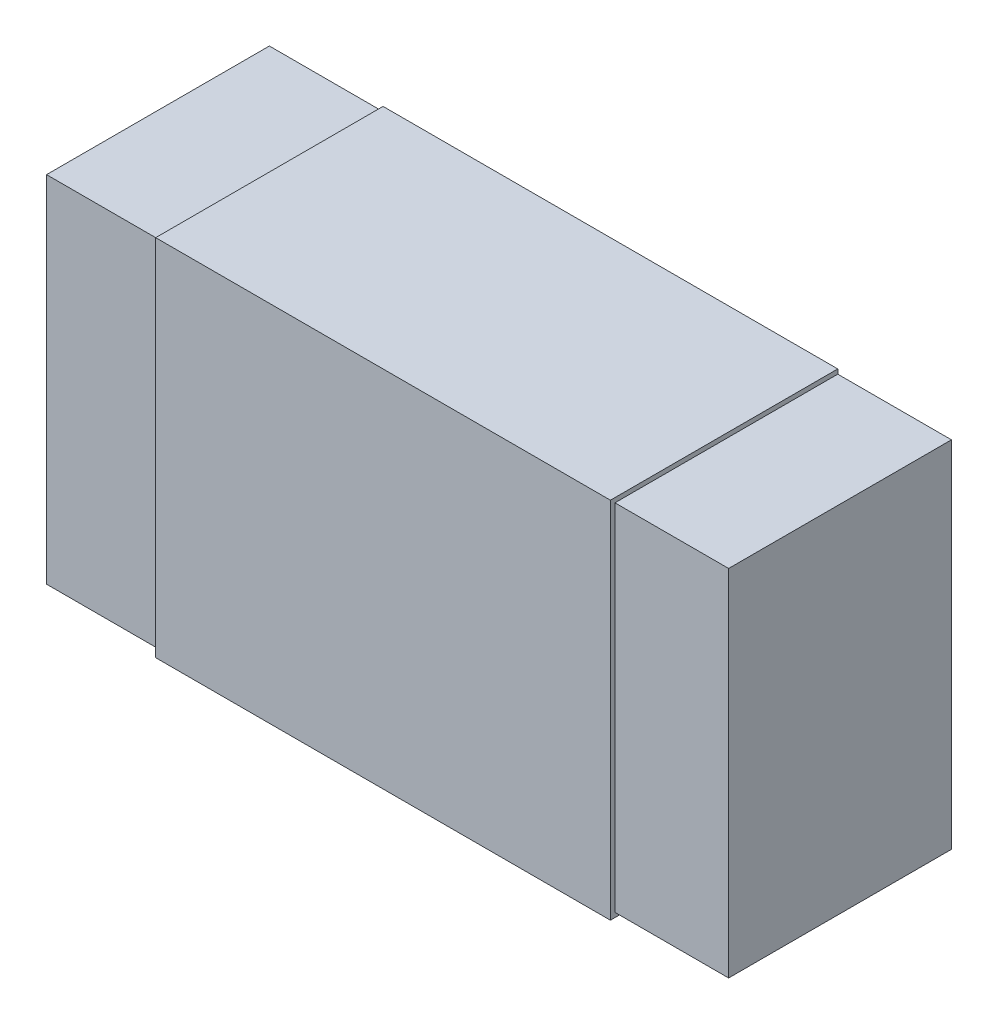
ISO-10303-21;
HEADER;
FILE_DESCRIPTION(('STEP AP214'),'2;1');
FILE_NAME('part.step','',(''),(''),'','','');
FILE_SCHEMA(('AUTOMOTIVE_DESIGN { 1 0 10303 214 1 1 1 1 }'));
ENDSEC;
DATA;
#1=APPLICATION_CONTEXT('core data for automotive mechanical design processes');
#2=APPLICATION_PROTOCOL_DEFINITION('international standard','automotive_design',2000,#1);
#3=PRODUCT_CONTEXT('',#1,'mechanical');
#4=PRODUCT('Part','Part','',(#3));
#5=PRODUCT_RELATED_PRODUCT_CATEGORY('part','',(#4));
#6=PRODUCT_DEFINITION_FORMATION('','',#4);
#7=PRODUCT_DEFINITION_CONTEXT('part definition',#1,'design');
#8=PRODUCT_DEFINITION('design','',#6,#7);
#9=PRODUCT_DEFINITION_SHAPE('','',#8);
#10=(LENGTH_UNIT() NAMED_UNIT(*) SI_UNIT(.MILLI.,.METRE.));
#11=(NAMED_UNIT(*) PLANE_ANGLE_UNIT() SI_UNIT($,.RADIAN.));
#12=(NAMED_UNIT(*) SI_UNIT($,.STERADIAN.) SOLID_ANGLE_UNIT());
#13=UNCERTAINTY_MEASURE_WITH_UNIT(LENGTH_MEASURE(1.E-05),#10,'distance_accuracy_value','');
#14=(GEOMETRIC_REPRESENTATION_CONTEXT(3) GLOBAL_UNCERTAINTY_ASSIGNED_CONTEXT((#13)) GLOBAL_UNIT_ASSIGNED_CONTEXT((#10,
#11,#12)) REPRESENTATION_CONTEXT('',''));
#15=CARTESIAN_POINT('',(0.,0.,0.));
#16=DIRECTION('',(0.,0.,1.));
#17=DIRECTION('',(1.,0.,0.));
#18=AXIS2_PLACEMENT_3D('',#15,#16,#17);
#19=CARTESIAN_POINT('',(-0.5,0.4,0.5));
#20=DIRECTION('',(1.,0.,0.));
#21=DIRECTION('',(0.,1.,0.));
#22=AXIS2_PLACEMENT_3D('',#19,#20,#21);
#23=PLANE('',#22);
#24=DIRECTION('',(0.,0.,-1.));
#25=VECTOR('',#24,1.);
#26=CARTESIAN_POINT('',(-0.5,0.39,0.49));
#27=LINE('',#26,#25);
#28=CARTESIAN_POINT('',(-0.5,0.39,0.49));
#29=VERTEX_POINT('',#28);
#30=CARTESIAN_POINT('',(-0.5,0.39,0.));
#31=VERTEX_POINT('',#30);
#32=EDGE_CURVE('E150',#29,#31,#27,.T.);
#33=ORIENTED_EDGE('',*,*,#32,.F.);
#34=DIRECTION('',(0.,-1.,0.));
#35=VECTOR('',#34,1.);
#36=CARTESIAN_POINT('',(-0.5,0.39,0.49));
#37=LINE('',#36,#35);
#38=CARTESIAN_POINT('',(-0.5,-0.39,0.49));
#39=VERTEX_POINT('',#38);
#40=EDGE_CURVE('E142',#29,#39,#37,.T.);
#41=ORIENTED_EDGE('',*,*,#40,.T.);
#42=DIRECTION('',(0.,0.,-1.));
#43=VECTOR('',#42,1.);
#44=CARTESIAN_POINT('',(-0.5,-0.39,0.49));
#45=LINE('',#44,#43);
#46=CARTESIAN_POINT('',(-0.5,-0.39,0.));
#47=VERTEX_POINT('',#46);
#48=EDGE_CURVE('E127',#39,#47,#45,.T.);
#49=ORIENTED_EDGE('',*,*,#48,.T.);
#50=DIRECTION('',(0.,-1.,0.));
#51=VECTOR('',#50,1.);
#52=CARTESIAN_POINT('',(-0.5,0.4,0.));
#53=LINE('',#52,#51);
#54=CARTESIAN_POINT('',(-0.5,-0.4,0.));
#55=VERTEX_POINT('',#54);
#56=EDGE_CURVE('E236',#47,#55,#53,.T.);
#57=ORIENTED_EDGE('',*,*,#56,.T.);
#58=DIRECTION('',(0.,0.,-1.));
#59=VECTOR('',#58,1.);
#60=CARTESIAN_POINT('',(-0.5,-0.4,0.5));
#61=LINE('',#60,#59);
#62=CARTESIAN_POINT('',(-0.5,-0.4,0.5));
#63=VERTEX_POINT('',#62);
#64=EDGE_CURVE('E245',#63,#55,#61,.T.);
#65=ORIENTED_EDGE('',*,*,#64,.F.);
#66=DIRECTION('',(0.,-1.,0.));
#67=VECTOR('',#66,1.);
#68=CARTESIAN_POINT('',(-0.5,0.4,0.5));
#69=LINE('',#68,#67);
#70=CARTESIAN_POINT('',(-0.5,0.4,0.5));
#71=VERTEX_POINT('',#70);
#72=EDGE_CURVE('E222',#71,#63,#69,.T.);
#73=ORIENTED_EDGE('',*,*,#72,.F.);
#74=DIRECTION('',(0.,0.,-1.));
#75=VECTOR('',#74,1.);
#76=CARTESIAN_POINT('',(-0.5,0.4,0.5));
#77=LINE('',#76,#75);
#78=CARTESIAN_POINT('',(-0.5,0.4,0.));
#79=VERTEX_POINT('',#78);
#80=EDGE_CURVE('E48',#71,#79,#77,.T.);
#81=ORIENTED_EDGE('',*,*,#80,.T.);
#82=EDGE_CURVE('E237',#79,#31,#53,.T.);
#83=ORIENTED_EDGE('',*,*,#82,.T.);
#84=EDGE_LOOP('',(#33,#41,#49,#57,#65,#73,#81,#83));
#85=FACE_BOUND('',#84,.T.);
#86=ADVANCED_FACE('F39',(#85),#23,.F.);
#87=CARTESIAN_POINT('',(0.5,0.4,0.5));
#88=DIRECTION('',(-1.,0.,0.));
#89=DIRECTION('',(0.,-1.,0.));
#90=AXIS2_PLACEMENT_3D('',#87,#88,#89);
#91=PLANE('',#90);
#92=DIRECTION('',(0.,0.,-1.));
#93=VECTOR('',#92,1.);
#94=CARTESIAN_POINT('',(0.5,-0.39,0.49));
#95=LINE('',#94,#93);
#96=CARTESIAN_POINT('',(0.5,-0.39,0.49));
#97=VERTEX_POINT('',#96);
#98=CARTESIAN_POINT('',(0.5,-0.39,0.));
#99=VERTEX_POINT('',#98);
#100=EDGE_CURVE('E202',#97,#99,#95,.T.);
#101=ORIENTED_EDGE('',*,*,#100,.F.);
#102=DIRECTION('',(0.,1.,0.));
#103=VECTOR('',#102,1.);
#104=CARTESIAN_POINT('',(0.5,0.39,0.49));
#105=LINE('',#104,#103);
#106=CARTESIAN_POINT('',(0.5,0.39,0.49));
#107=VERTEX_POINT('',#106);
#108=EDGE_CURVE('E175',#97,#107,#105,.T.);
#109=ORIENTED_EDGE('',*,*,#108,.T.);
#110=DIRECTION('',(0.,0.,-1.));
#111=VECTOR('',#110,1.);
#112=CARTESIAN_POINT('',(0.5,0.39,0.49));
#113=LINE('',#112,#111);
#114=CARTESIAN_POINT('',(0.5,0.39,0.));
#115=VERTEX_POINT('',#114);
#116=EDGE_CURVE('E192',#107,#115,#113,.T.);
#117=ORIENTED_EDGE('',*,*,#116,.T.);
#118=DIRECTION('',(0.,1.,0.));
#119=VECTOR('',#118,1.);
#120=CARTESIAN_POINT('',(0.5,0.4,0.));
#121=LINE('',#120,#119);
#122=CARTESIAN_POINT('',(0.5,0.4,0.));
#123=VERTEX_POINT('',#122);
#124=EDGE_CURVE('E205',#115,#123,#121,.T.);
#125=ORIENTED_EDGE('',*,*,#124,.T.);
#126=DIRECTION('',(0.,0.,-1.));
#127=VECTOR('',#126,1.);
#128=CARTESIAN_POINT('',(0.5,0.4,0.5));
#129=LINE('',#128,#127);
#130=CARTESIAN_POINT('',(0.5,0.4,0.5));
#131=VERTEX_POINT('',#130);
#132=EDGE_CURVE('E11',#131,#123,#129,.T.);
#133=ORIENTED_EDGE('',*,*,#132,.F.);
#134=DIRECTION('',(0.,1.,0.));
#135=VECTOR('',#134,1.);
#136=CARTESIAN_POINT('',(0.5,0.4,0.5));
#137=LINE('',#136,#135);
#138=CARTESIAN_POINT('',(0.5,-0.4,0.5));
#139=VERTEX_POINT('',#138);
#140=EDGE_CURVE('E214',#139,#131,#137,.T.);
#141=ORIENTED_EDGE('',*,*,#140,.F.);
#142=DIRECTION('',(0.,0.,-1.));
#143=VECTOR('',#142,1.);
#144=CARTESIAN_POINT('',(0.5,-0.4,0.5));
#145=LINE('',#144,#143);
#146=CARTESIAN_POINT('',(0.5,-0.4,0.));
#147=VERTEX_POINT('',#146);
#148=EDGE_CURVE('E228',#139,#147,#145,.T.);
#149=ORIENTED_EDGE('',*,*,#148,.T.);
#150=EDGE_CURVE('E229',#147,#99,#121,.T.);
#151=ORIENTED_EDGE('',*,*,#150,.T.);
#152=EDGE_LOOP('',(#101,#109,#117,#125,#133,#141,#149,#151));
#153=FACE_BOUND('',#152,.T.);
#154=ADVANCED_FACE('F41',(#153),#91,.F.);
#155=CARTESIAN_POINT('',(-0.5,0.4,0.5));
#156=DIRECTION('',(0.,-1.,0.));
#157=DIRECTION('',(0.,0.,-1.));
#158=AXIS2_PLACEMENT_3D('',#155,#156,#157);
#159=PLANE('',#158);
#160=DIRECTION('',(-1.,0.,0.));
#161=VECTOR('',#160,1.);
#162=CARTESIAN_POINT('',(-0.5,0.4,0.));
#163=LINE('',#162,#161);
#164=EDGE_CURVE('E233',#123,#79,#163,.T.);
#165=ORIENTED_EDGE('',*,*,#164,.T.);
#166=ORIENTED_EDGE('',*,*,#80,.F.);
#167=DIRECTION('',(-1.,0.,0.));
#168=VECTOR('',#167,1.);
#169=CARTESIAN_POINT('',(-0.5,0.4,0.5));
#170=LINE('',#169,#168);
#171=EDGE_CURVE('E218',#131,#71,#170,.T.);
#172=ORIENTED_EDGE('',*,*,#171,.F.);
#173=ORIENTED_EDGE('',*,*,#132,.T.);
#174=EDGE_LOOP('',(#165,#166,#172,#173));
#175=FACE_BOUND('',#174,.T.);
#176=ADVANCED_FACE('F285',(#175),#159,.F.);
#177=CARTESIAN_POINT('',(-0.5,-0.4,0.5));
#178=DIRECTION('',(0.,1.,0.));
#179=DIRECTION('',(0.,0.,1.));
#180=AXIS2_PLACEMENT_3D('',#177,#178,#179);
#181=PLANE('',#180);
#182=DIRECTION('',(1.,0.,0.));
#183=VECTOR('',#182,1.);
#184=CARTESIAN_POINT('',(-0.5,-0.4,0.));
#185=LINE('',#184,#183);
#186=EDGE_CURVE('E219',#55,#147,#185,.T.);
#187=ORIENTED_EDGE('',*,*,#186,.T.);
#188=ORIENTED_EDGE('',*,*,#148,.F.);
#189=DIRECTION('',(1.,0.,0.));
#190=VECTOR('',#189,1.);
#191=CARTESIAN_POINT('',(-0.5,-0.4,0.5));
#192=LINE('',#191,#190);
#193=EDGE_CURVE('E225',#63,#139,#192,.T.);
#194=ORIENTED_EDGE('',*,*,#193,.F.);
#195=ORIENTED_EDGE('',*,*,#64,.T.);
#196=EDGE_LOOP('',(#187,#188,#194,#195));
#197=FACE_BOUND('',#196,.T.);
#198=ADVANCED_FACE('F282',(#197),#181,.F.);
#199=CARTESIAN_POINT('',(0.,0.,0.5));
#200=DIRECTION('',(0.,0.,1.));
#201=DIRECTION('',(1.,0.,0.));
#202=AXIS2_PLACEMENT_3D('',#199,#200,#201);
#203=PLANE('',#202);
#204=ORIENTED_EDGE('',*,*,#140,.T.);
#205=ORIENTED_EDGE('',*,*,#171,.T.);
#206=ORIENTED_EDGE('',*,*,#72,.T.);
#207=ORIENTED_EDGE('',*,*,#193,.T.);
#208=EDGE_LOOP('',(#204,#205,#206,#207));
#209=FACE_BOUND('',#208,.T.);
#210=ADVANCED_FACE('F284',(#209),#203,.T.);
#211=CARTESIAN_POINT('',(0.,0.,0.));
#212=DIRECTION('',(0.,0.,1.));
#213=DIRECTION('',(1.,0.,0.));
#214=AXIS2_PLACEMENT_3D('',#211,#212,#213);
#215=PLANE('',#214);
#216=ORIENTED_EDGE('',*,*,#150,.F.);
#217=ORIENTED_EDGE('',*,*,#186,.F.);
#218=ORIENTED_EDGE('',*,*,#56,.F.);
#219=DIRECTION('',(-1.,0.,0.));
#220=VECTOR('',#219,1.);
#221=CARTESIAN_POINT('',(-0.5,-0.39,0.));
#222=LINE('',#221,#220);
#223=CARTESIAN_POINT('',(-0.75,-0.39,0.));
#224=VERTEX_POINT('',#223);
#225=EDGE_CURVE('E55',#47,#224,#222,.T.);
#226=ORIENTED_EDGE('',*,*,#225,.T.);
#227=DIRECTION('',(0.,1.,0.));
#228=VECTOR('',#227,1.);
#229=CARTESIAN_POINT('',(-0.75,0.39,0.));
#230=LINE('',#229,#228);
#231=CARTESIAN_POINT('',(-0.75,0.39,0.));
#232=VERTEX_POINT('',#231);
#233=EDGE_CURVE('E156',#224,#232,#230,.T.);
#234=ORIENTED_EDGE('',*,*,#233,.T.);
#235=DIRECTION('',(1.,0.,0.));
#236=VECTOR('',#235,1.);
#237=CARTESIAN_POINT('',(-0.5,0.39,0.));
#238=LINE('',#237,#236);
#239=EDGE_CURVE('E152',#232,#31,#238,.T.);
#240=ORIENTED_EDGE('',*,*,#239,.T.);
#241=ORIENTED_EDGE('',*,*,#82,.F.);
#242=ORIENTED_EDGE('',*,*,#164,.F.);
#243=ORIENTED_EDGE('',*,*,#124,.F.);
#244=DIRECTION('',(1.,0.,0.));
#245=VECTOR('',#244,1.);
#246=CARTESIAN_POINT('',(0.5,0.39,0.));
#247=LINE('',#246,#245);
#248=CARTESIAN_POINT('',(0.75,0.39,0.));
#249=VERTEX_POINT('',#248);
#250=EDGE_CURVE('E63',#115,#249,#247,.T.);
#251=ORIENTED_EDGE('',*,*,#250,.T.);
#252=DIRECTION('',(0.,-1.,0.));
#253=VECTOR('',#252,1.);
#254=CARTESIAN_POINT('',(0.75,0.39,0.));
#255=LINE('',#254,#253);
#256=CARTESIAN_POINT('',(0.75,-0.39,0.));
#257=VERTEX_POINT('',#256);
#258=EDGE_CURVE('E195',#249,#257,#255,.T.);
#259=ORIENTED_EDGE('',*,*,#258,.T.);
#260=DIRECTION('',(-1.,0.,0.));
#261=VECTOR('',#260,1.);
#262=CARTESIAN_POINT('',(0.5,-0.39,0.));
#263=LINE('',#262,#261);
#264=EDGE_CURVE('E180',#257,#99,#263,.T.);
#265=ORIENTED_EDGE('',*,*,#264,.T.);
#266=EDGE_LOOP('',(#216,#217,#218,#226,#234,#240,#241,#242,#243,#251,#259,#265));
#267=FACE_BOUND('',#266,.T.);
#268=ADVANCED_FACE('F258',(#267),#215,.F.);
#269=CARTESIAN_POINT('',(0.5,-0.39,0.49));
#270=DIRECTION('',(0.,-1.,0.));
#271=DIRECTION('',(1.,0.,0.));
#272=AXIS2_PLACEMENT_3D('',#269,#270,#271);
#273=PLANE('',#272);
#274=ORIENTED_EDGE('',*,*,#264,.F.);
#275=DIRECTION('',(0.,0.,-1.));
#276=VECTOR('',#275,1.);
#277=CARTESIAN_POINT('',(0.75,-0.39,0.49));
#278=LINE('',#277,#276);
#279=CARTESIAN_POINT('',(0.75,-0.39,0.49));
#280=VERTEX_POINT('',#279);
#281=EDGE_CURVE('E206',#280,#257,#278,.T.);
#282=ORIENTED_EDGE('',*,*,#281,.F.);
#283=DIRECTION('',(-1.,0.,0.));
#284=VECTOR('',#283,1.);
#285=CARTESIAN_POINT('',(0.5,-0.39,0.49));
#286=LINE('',#285,#284);
#287=EDGE_CURVE('E188',#280,#97,#286,.T.);
#288=ORIENTED_EDGE('',*,*,#287,.T.);
#289=ORIENTED_EDGE('',*,*,#100,.T.);
#290=EDGE_LOOP('',(#274,#282,#288,#289));
#291=FACE_BOUND('',#290,.T.);
#292=ADVANCED_FACE('F277',(#291),#273,.T.);
#293=CARTESIAN_POINT('',(0.75,0.39,0.49));
#294=DIRECTION('',(1.,0.,0.));
#295=DIRECTION('',(0.,1.,0.));
#296=AXIS2_PLACEMENT_3D('',#293,#294,#295);
#297=PLANE('',#296);
#298=ORIENTED_EDGE('',*,*,#258,.F.);
#299=DIRECTION('',(0.,0.,-1.));
#300=VECTOR('',#299,1.);
#301=CARTESIAN_POINT('',(0.75,0.39,0.49));
#302=LINE('',#301,#300);
#303=CARTESIAN_POINT('',(0.75,0.39,0.49));
#304=VERTEX_POINT('',#303);
#305=EDGE_CURVE('E209',#304,#249,#302,.T.);
#306=ORIENTED_EDGE('',*,*,#305,.F.);
#307=DIRECTION('',(0.,-1.,0.));
#308=VECTOR('',#307,1.);
#309=CARTESIAN_POINT('',(0.75,0.39,0.49));
#310=LINE('',#309,#308);
#311=EDGE_CURVE('E184',#304,#280,#310,.T.);
#312=ORIENTED_EDGE('',*,*,#311,.T.);
#313=ORIENTED_EDGE('',*,*,#281,.T.);
#314=EDGE_LOOP('',(#298,#306,#312,#313));
#315=FACE_BOUND('',#314,.T.);
#316=ADVANCED_FACE('F305',(#315),#297,.T.);
#317=CARTESIAN_POINT('',(0.5,0.39,0.49));
#318=DIRECTION('',(0.,1.,0.));
#319=DIRECTION('',(-1.,0.,0.));
#320=AXIS2_PLACEMENT_3D('',#317,#318,#319);
#321=PLANE('',#320);
#322=ORIENTED_EDGE('',*,*,#250,.F.);
#323=ORIENTED_EDGE('',*,*,#116,.F.);
#324=DIRECTION('',(1.,0.,0.));
#325=VECTOR('',#324,1.);
#326=CARTESIAN_POINT('',(0.5,0.39,0.49));
#327=LINE('',#326,#325);
#328=EDGE_CURVE('E179',#107,#304,#327,.T.);
#329=ORIENTED_EDGE('',*,*,#328,.T.);
#330=ORIENTED_EDGE('',*,*,#305,.T.);
#331=EDGE_LOOP('',(#322,#323,#329,#330));
#332=FACE_BOUND('',#331,.T.);
#333=ADVANCED_FACE('F301',(#332),#321,.T.);
#334=CARTESIAN_POINT('',(0.,0.,0.49));
#335=DIRECTION('',(0.,0.,1.));
#336=DIRECTION('',(1.,0.,0.));
#337=AXIS2_PLACEMENT_3D('',#334,#335,#336);
#338=PLANE('',#337);
#339=ORIENTED_EDGE('',*,*,#108,.F.);
#340=ORIENTED_EDGE('',*,*,#287,.F.);
#341=ORIENTED_EDGE('',*,*,#311,.F.);
#342=ORIENTED_EDGE('',*,*,#328,.F.);
#343=EDGE_LOOP('',(#339,#340,#341,#342));
#344=FACE_BOUND('',#343,.T.);
#345=ADVANCED_FACE('F304',(#344),#338,.T.);
#346=CARTESIAN_POINT('',(-0.5,0.39,0.49));
#347=DIRECTION('',(0.,1.,0.));
#348=DIRECTION('',(0.,0.,1.));
#349=AXIS2_PLACEMENT_3D('',#346,#347,#348);
#350=PLANE('',#349);
#351=ORIENTED_EDGE('',*,*,#239,.F.);
#352=DIRECTION('',(0.,0.,-1.));
#353=VECTOR('',#352,1.);
#354=CARTESIAN_POINT('',(-0.75,0.39,0.49));
#355=LINE('',#354,#353);
#356=CARTESIAN_POINT('',(-0.75,0.39,0.49));
#357=VERTEX_POINT('',#356);
#358=EDGE_CURVE('E170',#357,#232,#355,.T.);
#359=ORIENTED_EDGE('',*,*,#358,.F.);
#360=DIRECTION('',(1.,0.,0.));
#361=VECTOR('',#360,1.);
#362=CARTESIAN_POINT('',(-0.5,0.39,0.49));
#363=LINE('',#362,#361);
#364=EDGE_CURVE('E136',#357,#29,#363,.T.);
#365=ORIENTED_EDGE('',*,*,#364,.T.);
#366=ORIENTED_EDGE('',*,*,#32,.T.);
#367=EDGE_LOOP('',(#351,#359,#365,#366));
#368=FACE_BOUND('',#367,.T.);
#369=ADVANCED_FACE('F263',(#368),#350,.T.);
#370=CARTESIAN_POINT('',(-0.75,0.39,0.49));
#371=DIRECTION('',(-1.,0.,0.));
#372=DIRECTION('',(0.,-1.,0.));
#373=AXIS2_PLACEMENT_3D('',#370,#371,#372);
#374=PLANE('',#373);
#375=ORIENTED_EDGE('',*,*,#233,.F.);
#376=DIRECTION('',(0.,0.,-1.));
#377=VECTOR('',#376,1.);
#378=CARTESIAN_POINT('',(-0.75,-0.39,0.49));
#379=LINE('',#378,#377);
#380=CARTESIAN_POINT('',(-0.75,-0.39,0.49));
#381=VERTEX_POINT('',#380);
#382=EDGE_CURVE('E135',#381,#224,#379,.T.);
#383=ORIENTED_EDGE('',*,*,#382,.F.);
#384=DIRECTION('',(0.,1.,0.));
#385=VECTOR('',#384,1.);
#386=CARTESIAN_POINT('',(-0.75,0.39,0.49));
#387=LINE('',#386,#385);
#388=EDGE_CURVE('E145',#381,#357,#387,.T.);
#389=ORIENTED_EDGE('',*,*,#388,.T.);
#390=ORIENTED_EDGE('',*,*,#358,.T.);
#391=EDGE_LOOP('',(#375,#383,#389,#390));
#392=FACE_BOUND('',#391,.T.);
#393=ADVANCED_FACE('F265',(#392),#374,.T.);
#394=CARTESIAN_POINT('',(-0.5,-0.39,0.49));
#395=DIRECTION('',(0.,-1.,0.));
#396=DIRECTION('',(0.,0.,-1.));
#397=AXIS2_PLACEMENT_3D('',#394,#395,#396);
#398=PLANE('',#397);
#399=ORIENTED_EDGE('',*,*,#225,.F.);
#400=ORIENTED_EDGE('',*,*,#48,.F.);
#401=DIRECTION('',(-1.,0.,0.));
#402=VECTOR('',#401,1.);
#403=CARTESIAN_POINT('',(-0.5,-0.39,0.49));
#404=LINE('',#403,#402);
#405=EDGE_CURVE('E130',#39,#381,#404,.T.);
#406=ORIENTED_EDGE('',*,*,#405,.T.);
#407=ORIENTED_EDGE('',*,*,#382,.T.);
#408=EDGE_LOOP('',(#399,#400,#406,#407));
#409=FACE_BOUND('',#408,.T.);
#410=ADVANCED_FACE('F129',(#409),#398,.T.);
#411=CARTESIAN_POINT('',(0.,0.,0.49));
#412=DIRECTION('',(0.,0.,-1.));
#413=DIRECTION('',(-1.,0.,0.));
#414=AXIS2_PLACEMENT_3D('',#411,#412,#413);
#415=PLANE('',#414);
#416=ORIENTED_EDGE('',*,*,#40,.F.);
#417=ORIENTED_EDGE('',*,*,#364,.F.);
#418=ORIENTED_EDGE('',*,*,#388,.F.);
#419=ORIENTED_EDGE('',*,*,#405,.F.);
#420=EDGE_LOOP('',(#416,#417,#418,#419));
#421=FACE_BOUND('',#420,.T.);
#422=ADVANCED_FACE('F140',(#421),#415,.F.);
#423=CLOSED_SHELL('',(#86,#154,#176,#198,#210,#268,#292,#316,#333,#345,#369,#393,#410,#422));
#424=MANIFOLD_SOLID_BREP('B2',#423);
#425=ADVANCED_BREP_SHAPE_REPRESENTATION('',(#18,#424),#14);
#426=SHAPE_DEFINITION_REPRESENTATION(#9,#425);
ENDSEC;
END-ISO-10303-21;
